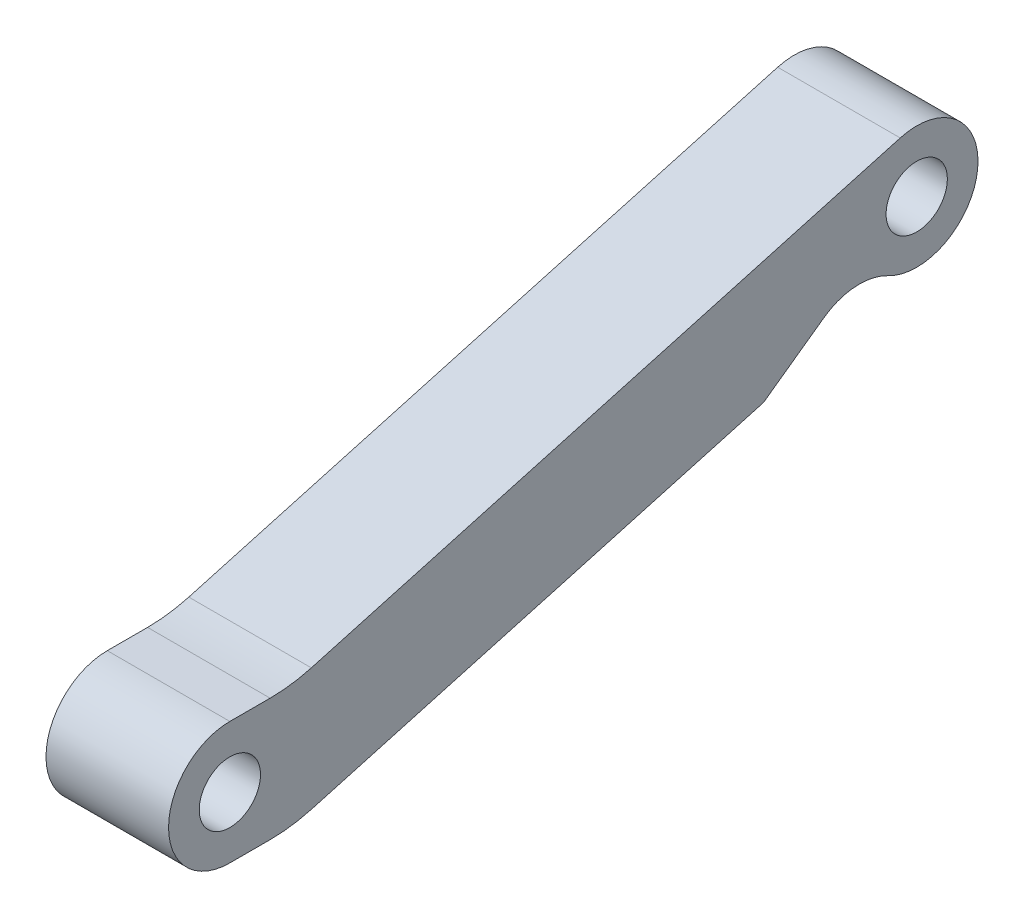
ISO-10303-21;
HEADER;
FILE_DESCRIPTION(('STEP AP214'),'2;1');
FILE_NAME('part.step','',(''),(''),'','','');
FILE_SCHEMA(('AUTOMOTIVE_DESIGN { 1 0 10303 214 1 1 1 1 }'));
ENDSEC;
DATA;
#1=APPLICATION_CONTEXT('core data for automotive mechanical design processes');
#2=APPLICATION_PROTOCOL_DEFINITION('international standard','automotive_design',2000,#1);
#3=PRODUCT_CONTEXT('',#1,'mechanical');
#4=PRODUCT('Part','Part','',(#3));
#5=PRODUCT_RELATED_PRODUCT_CATEGORY('part','',(#4));
#6=PRODUCT_DEFINITION_FORMATION('','',#4);
#7=PRODUCT_DEFINITION_CONTEXT('part definition',#1,'design');
#8=PRODUCT_DEFINITION('design','',#6,#7);
#9=PRODUCT_DEFINITION_SHAPE('','',#8);
#10=(LENGTH_UNIT() NAMED_UNIT(*) SI_UNIT(.MILLI.,.METRE.));
#11=(NAMED_UNIT(*) PLANE_ANGLE_UNIT() SI_UNIT($,.RADIAN.));
#12=(NAMED_UNIT(*) SI_UNIT($,.STERADIAN.) SOLID_ANGLE_UNIT());
#13=UNCERTAINTY_MEASURE_WITH_UNIT(LENGTH_MEASURE(1.E-05),#10,'distance_accuracy_value','');
#14=(GEOMETRIC_REPRESENTATION_CONTEXT(3) GLOBAL_UNCERTAINTY_ASSIGNED_CONTEXT((#13)) GLOBAL_UNIT_ASSIGNED_CONTEXT((#10,
#11,#12)) REPRESENTATION_CONTEXT('',''));
#15=CARTESIAN_POINT('',(0.,0.,0.));
#16=DIRECTION('',(0.,0.,1.));
#17=DIRECTION('',(1.,0.,0.));
#18=AXIS2_PLACEMENT_3D('',#15,#16,#17);
#19=CARTESIAN_POINT('',(-2.,-1.91202925532679,-63.1081173356861));
#20=DIRECTION('',(1.,0.,0.));
#21=DIRECTION('',(0.,0.,-1.));
#22=AXIS2_PLACEMENT_3D('',#19,#20,#21);
#23=CYLINDRICAL_SURFACE('',#22,2.);
#24=DIRECTION('',(1.,0.,0.));
#25=VECTOR('',#24,1.);
#26=CARTESIAN_POINT('',(-2.,-0.143514627663402,-64.0421173419712));
#27=LINE('',#26,#25);
#28=CARTESIAN_POINT('',(-2.,-0.143514627663402,-64.0421173419712));
#29=VERTEX_POINT('',#28);
#30=CARTESIAN_POINT('',(2.,-0.143514627663402,-64.0421173419712));
#31=VERTEX_POINT('',#30);
#32=EDGE_CURVE('E43',#29,#31,#27,.T.);
#33=ORIENTED_EDGE('',*,*,#32,.T.);
#34=CARTESIAN_POINT('',(2.,-1.91202925532679,-63.1081173356861));
#35=DIRECTION('',(1.,0.,0.));
#36=DIRECTION('',(0.,0.,-1.));
#37=AXIS2_PLACEMENT_3D('',#34,#35,#36);
#38=CIRCLE('',#37,2.);
#39=CARTESIAN_POINT('',(2.,-0.285871443395359,-61.9438103440836));
#40=VERTEX_POINT('',#39);
#41=EDGE_CURVE('E120',#31,#40,#38,.T.);
#42=ORIENTED_EDGE('',*,*,#41,.T.);
#43=DIRECTION('',(1.,0.,0.));
#44=VECTOR('',#43,1.);
#45=CARTESIAN_POINT('',(-2.,-0.285871443395359,-61.9438103440836));
#46=LINE('',#45,#44);
#47=CARTESIAN_POINT('',(-2.,-0.285871443395359,-61.9438103440836));
#48=VERTEX_POINT('',#47);
#49=EDGE_CURVE('E11',#48,#40,#46,.T.);
#50=ORIENTED_EDGE('',*,*,#49,.F.);
#51=CARTESIAN_POINT('',(-2.,-1.91202925532679,-63.1081173356861));
#52=DIRECTION('',(1.,0.,0.));
#53=DIRECTION('',(0.,0.,-1.));
#54=AXIS2_PLACEMENT_3D('',#51,#52,#53);
#55=CIRCLE('',#54,2.);
#56=EDGE_CURVE('E56',#29,#48,#55,.T.);
#57=ORIENTED_EDGE('',*,*,#56,.F.);
#58=EDGE_LOOP('',(#33,#42,#50,#57));
#59=FACE_BOUND('',#58,.T.);
#60=ADVANCED_FACE('F39',(#59),#23,.F.);
#61=CARTESIAN_POINT('',(-2.,-29.5092693167723,-21.1282375735662));
#62=DIRECTION('',(0.,-0.813078905965717,-0.58215349580123));
#63=DIRECTION('',(0.,0.58215349580123,-0.813078905965717));
#64=AXIS2_PLACEMENT_3D('',#61,#62,#63);
#65=PLANE('',#64);
#66=ORIENTED_EDGE('',*,*,#49,.T.);
#67=DIRECTION('',(0.,0.58215349580123,-0.813078905965717));
#68=VECTOR('',#67,1.);
#69=CARTESIAN_POINT('',(2.,-29.5092693167723,-21.1282375735662));
#70=LINE('',#69,#68);
#71=CARTESIAN_POINT('',(2.,-1.69471300573291,-59.9761173482563));
#72=VERTEX_POINT('',#71);
#73=EDGE_CURVE('E137',#72,#40,#70,.T.);
#74=ORIENTED_EDGE('',*,*,#73,.F.);
#75=DIRECTION('',(1.,0.,0.));
#76=VECTOR('',#75,1.);
#77=CARTESIAN_POINT('',(-2.,-1.69471300573291,-59.9761173482563));
#78=LINE('',#77,#76);
#79=CARTESIAN_POINT('',(-2.,-1.69471300573291,-59.9761173482563));
#80=VERTEX_POINT('',#79);
#81=EDGE_CURVE('E48',#80,#72,#78,.T.);
#82=ORIENTED_EDGE('',*,*,#81,.F.);
#83=DIRECTION('',(0.,0.58215349580123,-0.813078905965717));
#84=VECTOR('',#83,1.);
#85=CARTESIAN_POINT('',(-2.,-29.5092693167723,-21.1282375735662));
#86=LINE('',#85,#84);
#87=EDGE_CURVE('E124',#80,#48,#86,.T.);
#88=ORIENTED_EDGE('',*,*,#87,.T.);
#89=EDGE_LOOP('',(#66,#74,#82,#88));
#90=FACE_BOUND('',#89,.T.);
#91=ADVANCED_FACE('F232',(#90),#65,.T.);
#92=CARTESIAN_POINT('',(-2.,-17.108672315639,-4.77751952631985));
#93=DIRECTION('',(0.,-0.96315247012414,-0.268955980215663));
#94=DIRECTION('',(0.,0.268955980215663,-0.96315247012414));
#95=AXIS2_PLACEMENT_3D('',#92,#93,#94);
#96=PLANE('',#95);
#97=ORIENTED_EDGE('',*,*,#81,.T.);
#98=DIRECTION('',(0.,0.268955980215663,-0.96315247012414));
#99=VECTOR('',#98,1.);
#100=CARTESIAN_POINT('',(2.,-17.108672315639,-4.77751952631985));
#101=LINE('',#100,#99);
#102=CARTESIAN_POINT('',(2.,-5.8157623506207,-45.2183162655311));
#103=VERTEX_POINT('',#102);
#104=EDGE_CURVE('E161',#103,#72,#101,.T.);
#105=ORIENTED_EDGE('',*,*,#104,.F.);
#106=DIRECTION('',(1.,0.,0.));
#107=VECTOR('',#106,1.);
#108=CARTESIAN_POINT('',(-2.,-5.8157623506207,-45.2183162655311));
#109=LINE('',#108,#107);
#110=CARTESIAN_POINT('',(-2.,-5.8157623506207,-45.2183162655311));
#111=VERTEX_POINT('',#110);
#112=EDGE_CURVE('E192',#111,#103,#109,.T.);
#113=ORIENTED_EDGE('',*,*,#112,.F.);
#114=DIRECTION('',(0.,0.268955980215663,-0.96315247012414));
#115=VECTOR('',#114,1.);
#116=CARTESIAN_POINT('',(-2.,-17.108672315639,-4.77751952631985));
#117=LINE('',#116,#115);
#118=EDGE_CURVE('E188',#111,#80,#117,.T.);
#119=ORIENTED_EDGE('',*,*,#118,.T.);
#120=EDGE_LOOP('',(#97,#105,#113,#119));
#121=FACE_BOUND('',#120,.T.);
#122=ADVANCED_FACE('F230',(#121),#96,.T.);
#123=CARTESIAN_POINT('',(-2.,-1.00000000000001,-43.8735363644528));
#124=DIRECTION('',(1.,0.,0.));
#125=DIRECTION('',(0.,0.,-1.));
#126=AXIS2_PLACEMENT_3D('',#123,#124,#125);
#127=CYLINDRICAL_SURFACE('',#126,5.);
#128=ORIENTED_EDGE('',*,*,#112,.T.);
#129=CARTESIAN_POINT('',(2.,-1.00000000000001,-43.8735363644528));
#130=DIRECTION('',(1.,0.,0.));
#131=DIRECTION('',(0.,0.,-1.));
#132=AXIS2_PLACEMENT_3D('',#129,#130,#131);
#133=CIRCLE('',#132,5.);
#134=CARTESIAN_POINT('',(2.,-6.00000000000001,-43.8735363644528));
#135=VERTEX_POINT('',#134);
#136=EDGE_CURVE('E158',#135,#103,#133,.T.);
#137=ORIENTED_EDGE('',*,*,#136,.F.);
#138=DIRECTION('',(1.,0.,0.));
#139=VECTOR('',#138,1.);
#140=CARTESIAN_POINT('',(-2.,-6.00000000000001,-43.8735363644528));
#141=LINE('',#140,#139);
#142=CARTESIAN_POINT('',(-2.,-6.00000000000001,-43.8735363644528));
#143=VERTEX_POINT('',#142);
#144=EDGE_CURVE('E194',#143,#135,#141,.T.);
#145=ORIENTED_EDGE('',*,*,#144,.F.);
#146=CARTESIAN_POINT('',(-2.,-1.00000000000001,-43.8735363644528));
#147=DIRECTION('',(1.,0.,0.));
#148=DIRECTION('',(0.,0.,-1.));
#149=AXIS2_PLACEMENT_3D('',#146,#147,#148);
#150=CIRCLE('',#149,5.);
#151=EDGE_CURVE('E185',#143,#111,#150,.T.);
#152=ORIENTED_EDGE('',*,*,#151,.T.);
#153=EDGE_LOOP('',(#128,#137,#145,#152));
#154=FACE_BOUND('',#153,.T.);
#155=ADVANCED_FACE('F227',(#154),#127,.T.);
#156=CARTESIAN_POINT('',(-2.,-6.00000000000004,0.));
#157=DIRECTION('',(0.,-1.,0.));
#158=DIRECTION('',(0.,0.,-1.));
#159=AXIS2_PLACEMENT_3D('',#156,#157,#158);
#160=PLANE('',#159);
#161=ORIENTED_EDGE('',*,*,#144,.T.);
#162=DIRECTION('',(0.,0.,-1.));
#163=VECTOR('',#162,1.);
#164=CARTESIAN_POINT('',(2.,-6.00000000000004,0.));
#165=LINE('',#164,#163);
#166=CARTESIAN_POINT('',(2.,-6.00000000000001,-42.5585467859781));
#167=VERTEX_POINT('',#166);
#168=EDGE_CURVE('E155',#167,#135,#165,.T.);
#169=ORIENTED_EDGE('',*,*,#168,.F.);
#170=DIRECTION('',(1.,0.,0.));
#171=VECTOR('',#170,1.);
#172=CARTESIAN_POINT('',(-2.,-6.00000000000001,-42.5585467859781));
#173=LINE('',#172,#171);
#174=CARTESIAN_POINT('',(-2.,-6.00000000000001,-42.5585467859781));
#175=VERTEX_POINT('',#174);
#176=EDGE_CURVE('E196',#175,#167,#173,.T.);
#177=ORIENTED_EDGE('',*,*,#176,.F.);
#178=DIRECTION('',(0.,0.,-1.));
#179=VECTOR('',#178,1.);
#180=CARTESIAN_POINT('',(-2.,-6.00000000000004,0.));
#181=LINE('',#180,#179);
#182=EDGE_CURVE('E182',#175,#143,#181,.T.);
#183=ORIENTED_EDGE('',*,*,#182,.T.);
#184=EDGE_LOOP('',(#161,#169,#177,#183));
#185=FACE_BOUND('',#184,.T.);
#186=ADVANCED_FACE('F223',(#185),#160,.T.);
#187=CARTESIAN_POINT('',(-2.,-4.00000000000001,-42.5585467859781));
#188=DIRECTION('',(1.,0.,0.));
#189=DIRECTION('',(0.,0.,-1.));
#190=AXIS2_PLACEMENT_3D('',#187,#188,#189);
#191=CYLINDRICAL_SURFACE('',#190,2.);
#192=ORIENTED_EDGE('',*,*,#176,.T.);
#193=CARTESIAN_POINT('',(2.,-4.00000000000001,-42.5585467859781));
#194=DIRECTION('',(1.,0.,0.));
#195=DIRECTION('',(0.,0.,-1.));
#196=AXIS2_PLACEMENT_3D('',#193,#194,#195);
#197=CIRCLE('',#196,2.);
#198=CARTESIAN_POINT('',(2.,-2.00000000000001,-42.5585467859781));
#199=VERTEX_POINT('',#198);
#200=EDGE_CURVE('E152',#199,#167,#197,.T.);
#201=ORIENTED_EDGE('',*,*,#200,.F.);
#202=DIRECTION('',(1.,0.,0.));
#203=VECTOR('',#202,1.);
#204=CARTESIAN_POINT('',(-2.,-2.00000000000001,-42.5585467859781));
#205=LINE('',#204,#203);
#206=CARTESIAN_POINT('',(-2.,-2.00000000000001,-42.5585467859781));
#207=VERTEX_POINT('',#206);
#208=EDGE_CURVE('E198',#207,#199,#205,.T.);
#209=ORIENTED_EDGE('',*,*,#208,.F.);
#210=CARTESIAN_POINT('',(-2.,-4.00000000000001,-42.5585467859781));
#211=DIRECTION('',(1.,0.,0.));
#212=DIRECTION('',(0.,0.,-1.));
#213=AXIS2_PLACEMENT_3D('',#210,#211,#212);
#214=CIRCLE('',#213,2.);
#215=EDGE_CURVE('E179',#207,#175,#214,.T.);
#216=ORIENTED_EDGE('',*,*,#215,.T.);
#217=EDGE_LOOP('',(#192,#201,#209,#216));
#218=FACE_BOUND('',#217,.T.);
#219=ADVANCED_FACE('F220',(#218),#191,.T.);
#220=CARTESIAN_POINT('',(-2.,-2.00000000000001,0.));
#221=DIRECTION('',(0.,-1.,0.));
#222=DIRECTION('',(0.,0.,-1.));
#223=AXIS2_PLACEMENT_3D('',#220,#221,#222);
#224=PLANE('',#223);
#225=ORIENTED_EDGE('',*,*,#208,.T.);
#226=DIRECTION('',(0.,0.,-1.));
#227=VECTOR('',#226,1.);
#228=CARTESIAN_POINT('',(2.,-2.00000000000001,0.));
#229=LINE('',#228,#227);
#230=CARTESIAN_POINT('',(2.,-2.00000000000001,-43.8735363644527));
#231=VERTEX_POINT('',#230);
#232=EDGE_CURVE('E149',#199,#231,#229,.T.);
#233=ORIENTED_EDGE('',*,*,#232,.T.);
#234=DIRECTION('',(1.,0.,0.));
#235=VECTOR('',#234,1.);
#236=CARTESIAN_POINT('',(-2.,-2.00000000000001,-43.8735363644527));
#237=LINE('',#236,#235);
#238=CARTESIAN_POINT('',(-2.,-2.00000000000001,-43.8735363644527));
#239=VERTEX_POINT('',#238);
#240=EDGE_CURVE('E200',#239,#231,#237,.T.);
#241=ORIENTED_EDGE('',*,*,#240,.F.);
#242=DIRECTION('',(0.,0.,-1.));
#243=VECTOR('',#242,1.);
#244=CARTESIAN_POINT('',(-2.,-2.00000000000001,0.));
#245=LINE('',#244,#243);
#246=EDGE_CURVE('E177',#207,#239,#245,.T.);
#247=ORIENTED_EDGE('',*,*,#246,.F.);
#248=EDGE_LOOP('',(#225,#233,#241,#247));
#249=FACE_BOUND('',#248,.T.);
#250=ADVANCED_FACE('F215',(#249),#224,.F.);
#251=CARTESIAN_POINT('',(-2.,2.99999999999999,-43.8735363644527));
#252=DIRECTION('',(1.,0.,0.));
#253=DIRECTION('',(0.,0.,-1.));
#254=AXIS2_PLACEMENT_3D('',#251,#252,#253);
#255=CYLINDRICAL_SURFACE('',#254,5.);
#256=ORIENTED_EDGE('',*,*,#240,.T.);
#257=CARTESIAN_POINT('',(2.,2.99999999999999,-43.8735363644527));
#258=DIRECTION('',(1.,0.,0.));
#259=DIRECTION('',(0.,0.,-1.));
#260=AXIS2_PLACEMENT_3D('',#257,#258,#259);
#261=CIRCLE('',#260,5.);
#262=CARTESIAN_POINT('',(2.,-1.8157623506207,-45.2183162655311));
#263=VERTEX_POINT('',#262);
#264=EDGE_CURVE('E146',#231,#263,#261,.T.);
#265=ORIENTED_EDGE('',*,*,#264,.T.);
#266=DIRECTION('',(1.,0.,0.));
#267=VECTOR('',#266,1.);
#268=CARTESIAN_POINT('',(-2.,-1.8157623506207,-45.2183162655311));
#269=LINE('',#268,#267);
#270=CARTESIAN_POINT('',(-2.,-1.8157623506207,-45.2183162655311));
#271=VERTEX_POINT('',#270);
#272=EDGE_CURVE('E202',#271,#263,#269,.T.);
#273=ORIENTED_EDGE('',*,*,#272,.F.);
#274=CARTESIAN_POINT('',(-2.,2.99999999999999,-43.8735363644527));
#275=DIRECTION('',(1.,0.,0.));
#276=DIRECTION('',(0.,0.,-1.));
#277=AXIS2_PLACEMENT_3D('',#274,#275,#276);
#278=CIRCLE('',#277,5.);
#279=EDGE_CURVE('E175',#239,#271,#278,.T.);
#280=ORIENTED_EDGE('',*,*,#279,.F.);
#281=EDGE_LOOP('',(#256,#265,#273,#280));
#282=FACE_BOUND('',#281,.T.);
#283=ADVANCED_FACE('F211',(#282),#255,.F.);
#284=CARTESIAN_POINT('',(-2.,-13.3980215928141,-3.74133705952235));
#285=DIRECTION('',(0.,-0.96315247012414,-0.268955980215663));
#286=DIRECTION('',(0.,0.268955980215663,-0.96315247012414));
#287=AXIS2_PLACEMENT_3D('',#284,#285,#286);
#288=PLANE('',#287);
#289=ORIENTED_EDGE('',*,*,#272,.T.);
#290=DIRECTION('',(0.,0.268955980215663,-0.96315247012414));
#291=VECTOR('',#290,1.);
#292=CARTESIAN_POINT('',(2.,-13.3980215928141,-3.74133705952235));
#293=LINE('',#292,#291);
#294=CARTESIAN_POINT('',(2.,3.55130494024827,-64.438205387825));
#295=VERTEX_POINT('',#294);
#296=EDGE_CURVE('E132',#263,#295,#293,.T.);
#297=ORIENTED_EDGE('',*,*,#296,.T.);
#298=DIRECTION('',(1.,0.,0.));
#299=VECTOR('',#298,1.);
#300=CARTESIAN_POINT('',(-2.,3.55130494024827,-64.438205387825));
#301=LINE('',#300,#299);
#302=CARTESIAN_POINT('',(-2.,3.55130494024827,-64.438205387825));
#303=VERTEX_POINT('',#302);
#304=EDGE_CURVE('E123',#303,#295,#301,.T.);
#305=ORIENTED_EDGE('',*,*,#304,.F.);
#306=DIRECTION('',(0.,0.268955980215663,-0.96315247012414));
#307=VECTOR('',#306,1.);
#308=CARTESIAN_POINT('',(-2.,-13.3980215928141,-3.74133705952235));
#309=LINE('',#308,#307);
#310=EDGE_CURVE('E173',#271,#303,#309,.T.);
#311=ORIENTED_EDGE('',*,*,#310,.F.);
#312=EDGE_LOOP('',(#289,#297,#305,#311));
#313=FACE_BOUND('',#312,.T.);
#314=ADVANCED_FACE('F206',(#313),#288,.F.);
#315=CARTESIAN_POINT('',(-2.,1.62499999999999,-64.9761173482563));
#316=DIRECTION('',(1.,0.,0.));
#317=DIRECTION('',(0.,0.,-1.));
#318=AXIS2_PLACEMENT_3D('',#315,#316,#317);
#319=CYLINDRICAL_SURFACE('',#318,1.00000000000001);
#320=CARTESIAN_POINT('',(-2.,1.62499999999999,-64.9761173482563));
#321=DIRECTION('',(1.,0.,0.));
#322=DIRECTION('',(0.,0.,-1.));
#323=AXIS2_PLACEMENT_3D('',#320,#321,#322);
#324=CIRCLE('',#323,1.00000000000001);
#325=CARTESIAN_POINT('',(-2.,1.62499999999999,-65.9761173482564));
#326=VERTEX_POINT('',#325);
#327=EDGE_CURVE('E167',#326,#326,#324,.T.);
#328=ORIENTED_EDGE('',*,*,#327,.F.);
#329=EDGE_LOOP('',(#328));
#330=FACE_BOUND('',#329,.T.);
#331=CARTESIAN_POINT('',(2.,1.62499999999999,-64.9761173482563));
#332=DIRECTION('',(1.,0.,0.));
#333=DIRECTION('',(0.,0.,-1.));
#334=AXIS2_PLACEMENT_3D('',#331,#332,#333);
#335=CIRCLE('',#334,1.00000000000001);
#336=CARTESIAN_POINT('',(2.,1.62499999999999,-65.9761173482564));
#337=VERTEX_POINT('',#336);
#338=EDGE_CURVE('E138',#337,#337,#335,.T.);
#339=ORIENTED_EDGE('',*,*,#338,.T.);
#340=EDGE_LOOP('',(#339));
#341=FACE_BOUND('',#340,.T.);
#342=ADVANCED_FACE('F252',(#330,#341),#319,.F.);
#343=CARTESIAN_POINT('',(-2.,-4.00000000000001,-42.5585467859781));
#344=DIRECTION('',(1.,0.,0.));
#345=DIRECTION('',(0.,0.,-1.));
#346=AXIS2_PLACEMENT_3D('',#343,#344,#345);
#347=CYLINDRICAL_SURFACE('',#346,1.00000000000001);
#348=CARTESIAN_POINT('',(-2.,-4.00000000000001,-42.5585467859781));
#349=DIRECTION('',(1.,0.,0.));
#350=DIRECTION('',(0.,0.,-1.));
#351=AXIS2_PLACEMENT_3D('',#348,#349,#350);
#352=CIRCLE('',#351,1.00000000000001);
#353=CARTESIAN_POINT('',(-2.,-4.00000000000001,-43.5585467859781));
#354=VERTEX_POINT('',#353);
#355=EDGE_CURVE('E164',#354,#354,#352,.T.);
#356=ORIENTED_EDGE('',*,*,#355,.F.);
#357=EDGE_LOOP('',(#356));
#358=FACE_BOUND('',#357,.T.);
#359=CARTESIAN_POINT('',(2.,-4.00000000000001,-42.5585467859781));
#360=DIRECTION('',(1.,0.,0.));
#361=DIRECTION('',(0.,0.,-1.));
#362=AXIS2_PLACEMENT_3D('',#359,#360,#361);
#363=CIRCLE('',#362,1.00000000000001);
#364=CARTESIAN_POINT('',(2.,-4.00000000000001,-43.5585467859781));
#365=VERTEX_POINT('',#364);
#366=EDGE_CURVE('E141',#365,#365,#363,.T.);
#367=ORIENTED_EDGE('',*,*,#366,.T.);
#368=EDGE_LOOP('',(#367));
#369=FACE_BOUND('',#368,.T.);
#370=ADVANCED_FACE('F41',(#358,#369),#347,.F.);
#371=CARTESIAN_POINT('',(-2.,1.62499999999999,-64.9761173482563));
#372=DIRECTION('',(1.,0.,0.));
#373=DIRECTION('',(0.,0.,-1.));
#374=AXIS2_PLACEMENT_3D('',#371,#372,#373);
#375=CYLINDRICAL_SURFACE('',#374,2.);
#376=ORIENTED_EDGE('',*,*,#304,.T.);
#377=CARTESIAN_POINT('',(2.,1.62499999999999,-64.9761173482563));
#378=DIRECTION('',(1.,0.,0.));
#379=DIRECTION('',(0.,0.,-1.));
#380=AXIS2_PLACEMENT_3D('',#377,#378,#379);
#381=CIRCLE('',#380,2.);
#382=EDGE_CURVE('E126',#31,#295,#381,.T.);
#383=ORIENTED_EDGE('',*,*,#382,.F.);
#384=ORIENTED_EDGE('',*,*,#32,.F.);
#385=CARTESIAN_POINT('',(-2.,1.62499999999999,-64.9761173482563));
#386=DIRECTION('',(1.,0.,0.));
#387=DIRECTION('',(0.,0.,-1.));
#388=AXIS2_PLACEMENT_3D('',#385,#386,#387);
#389=CIRCLE('',#388,2.);
#390=EDGE_CURVE('E171',#29,#303,#389,.T.);
#391=ORIENTED_EDGE('',*,*,#390,.T.);
#392=EDGE_LOOP('',(#376,#383,#384,#391));
#393=FACE_BOUND('',#392,.T.);
#394=ADVANCED_FACE('F127',(#393),#375,.T.);
#395=CARTESIAN_POINT('',(-2.,0.,0.));
#396=DIRECTION('',(1.,0.,0.));
#397=DIRECTION('',(0.,0.,-1.));
#398=AXIS2_PLACEMENT_3D('',#395,#396,#397);
#399=PLANE('',#398);
#400=ORIENTED_EDGE('',*,*,#355,.T.);
#401=EDGE_LOOP('',(#400));
#402=FACE_BOUND('',#401,.T.);
#403=ORIENTED_EDGE('',*,*,#327,.T.);
#404=EDGE_LOOP('',(#403));
#405=FACE_BOUND('',#404,.T.);
#406=ORIENTED_EDGE('',*,*,#56,.T.);
#407=ORIENTED_EDGE('',*,*,#87,.F.);
#408=ORIENTED_EDGE('',*,*,#118,.F.);
#409=ORIENTED_EDGE('',*,*,#151,.F.);
#410=ORIENTED_EDGE('',*,*,#182,.F.);
#411=ORIENTED_EDGE('',*,*,#215,.F.);
#412=ORIENTED_EDGE('',*,*,#246,.T.);
#413=ORIENTED_EDGE('',*,*,#279,.T.);
#414=ORIENTED_EDGE('',*,*,#310,.T.);
#415=ORIENTED_EDGE('',*,*,#390,.F.);
#416=EDGE_LOOP('',(#406,#407,#408,#409,#410,#411,#412,#413,#414,#415));
#417=FACE_BOUND('',#416,.T.);
#418=ADVANCED_FACE('F233',(#402,#405,#417),#399,.F.);
#419=CARTESIAN_POINT('',(2.,0.,0.));
#420=DIRECTION('',(1.,0.,0.));
#421=DIRECTION('',(0.,0.,-1.));
#422=AXIS2_PLACEMENT_3D('',#419,#420,#421);
#423=PLANE('',#422);
#424=ORIENTED_EDGE('',*,*,#366,.F.);
#425=EDGE_LOOP('',(#424));
#426=FACE_BOUND('',#425,.T.);
#427=ORIENTED_EDGE('',*,*,#338,.F.);
#428=EDGE_LOOP('',(#427));
#429=FACE_BOUND('',#428,.T.);
#430=ORIENTED_EDGE('',*,*,#41,.F.);
#431=ORIENTED_EDGE('',*,*,#382,.T.);
#432=ORIENTED_EDGE('',*,*,#296,.F.);
#433=ORIENTED_EDGE('',*,*,#264,.F.);
#434=ORIENTED_EDGE('',*,*,#232,.F.);
#435=ORIENTED_EDGE('',*,*,#200,.T.);
#436=ORIENTED_EDGE('',*,*,#168,.T.);
#437=ORIENTED_EDGE('',*,*,#136,.T.);
#438=ORIENTED_EDGE('',*,*,#104,.T.);
#439=ORIENTED_EDGE('',*,*,#73,.T.);
#440=EDGE_LOOP('',(#430,#431,#432,#433,#434,#435,#436,#437,#438,#439));
#441=FACE_BOUND('',#440,.T.);
#442=ADVANCED_FACE('F135',(#426,#429,#441),#423,.T.);
#443=CLOSED_SHELL('',(#60,#91,#122,#155,#186,#219,#250,#283,#314,#342,#370,#394,#418,#442));
#444=MANIFOLD_SOLID_BREP('B2',#443);
#445=ADVANCED_BREP_SHAPE_REPRESENTATION('',(#18,#444),#14);
#446=SHAPE_DEFINITION_REPRESENTATION(#9,#445);
ENDSEC;
END-ISO-10303-21;
